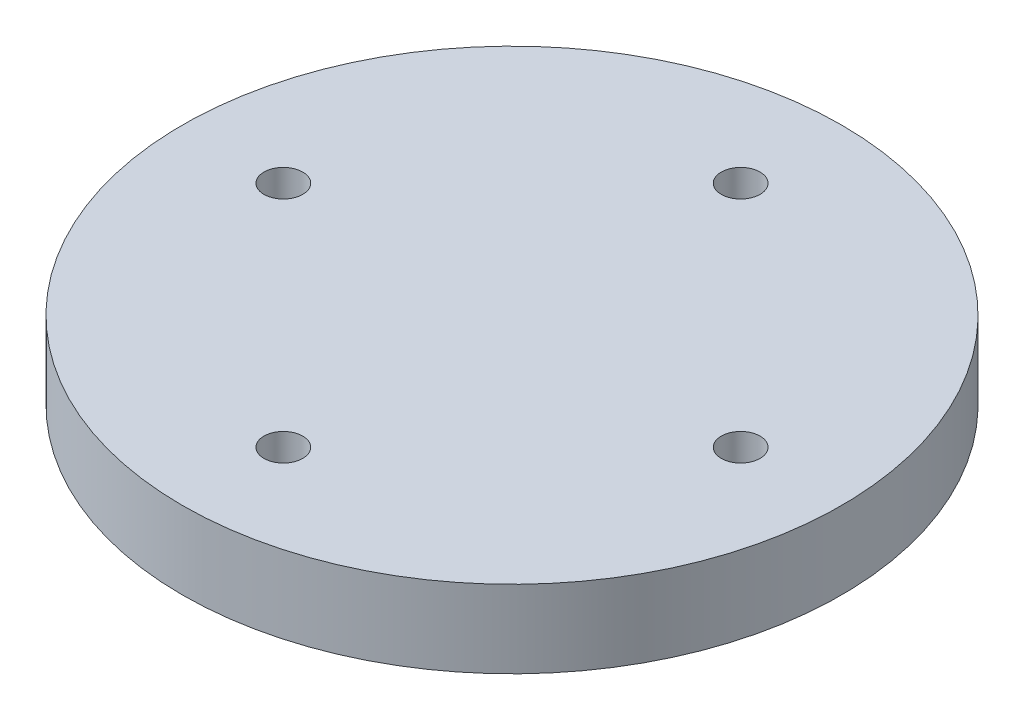
ISO-10303-21;
HEADER;
FILE_DESCRIPTION(('STEP AP214'),'2;1');
FILE_NAME('part.step','',(''),(''),'','','');
FILE_SCHEMA(('AUTOMOTIVE_DESIGN { 1 0 10303 214 1 1 1 1 }'));
ENDSEC;
DATA;
#1=APPLICATION_CONTEXT('core data for automotive mechanical design processes');
#2=APPLICATION_PROTOCOL_DEFINITION('international standard','automotive_design',2000,#1);
#3=PRODUCT_CONTEXT('',#1,'mechanical');
#4=PRODUCT('Part','Part','',(#3));
#5=PRODUCT_RELATED_PRODUCT_CATEGORY('part','',(#4));
#6=PRODUCT_DEFINITION_FORMATION('','',#4);
#7=PRODUCT_DEFINITION_CONTEXT('part definition',#1,'design');
#8=PRODUCT_DEFINITION('design','',#6,#7);
#9=PRODUCT_DEFINITION_SHAPE('','',#8);
#10=(LENGTH_UNIT() NAMED_UNIT(*) SI_UNIT(.MILLI.,.METRE.));
#11=(NAMED_UNIT(*) PLANE_ANGLE_UNIT() SI_UNIT($,.RADIAN.));
#12=(NAMED_UNIT(*) SI_UNIT($,.STERADIAN.) SOLID_ANGLE_UNIT());
#13=UNCERTAINTY_MEASURE_WITH_UNIT(LENGTH_MEASURE(1.E-05),#10,'distance_accuracy_value','');
#14=(GEOMETRIC_REPRESENTATION_CONTEXT(3) GLOBAL_UNCERTAINTY_ASSIGNED_CONTEXT((#13)) GLOBAL_UNIT_ASSIGNED_CONTEXT((#10,
#11,#12)) REPRESENTATION_CONTEXT('',''));
#15=CARTESIAN_POINT('',(0.,0.,0.));
#16=DIRECTION('',(0.,0.,1.));
#17=DIRECTION('',(1.,0.,0.));
#18=AXIS2_PLACEMENT_3D('',#15,#16,#17);
#19=CARTESIAN_POINT('',(0.,10.,0.));
#20=DIRECTION('',(0.,-1.,0.));
#21=DIRECTION('',(0.,0.,-1.));
#22=AXIS2_PLACEMENT_3D('',#19,#20,#21);
#23=CYLINDRICAL_SURFACE('',#22,42.5);
#24=CARTESIAN_POINT('',(0.,10.,0.));
#25=DIRECTION('',(0.,1.,0.));
#26=DIRECTION('',(0.,0.,1.));
#27=AXIS2_PLACEMENT_3D('',#24,#25,#26);
#28=CIRCLE('',#27,42.5);
#29=CARTESIAN_POINT('',(0.,10.,42.5));
#30=VERTEX_POINT('',#29);
#31=EDGE_CURVE('E10',#30,#30,#28,.T.);
#32=ORIENTED_EDGE('',*,*,#31,.F.);
#33=EDGE_LOOP('',(#32));
#34=FACE_BOUND('',#33,.T.);
#35=CARTESIAN_POINT('',(0.,0.,0.));
#36=DIRECTION('',(0.,1.,0.));
#37=DIRECTION('',(0.,0.,1.));
#38=AXIS2_PLACEMENT_3D('',#35,#36,#37);
#39=CIRCLE('',#38,42.5);
#40=CARTESIAN_POINT('',(0.,0.,42.5));
#41=VERTEX_POINT('',#40);
#42=EDGE_CURVE('E32',#41,#41,#39,.T.);
#43=ORIENTED_EDGE('',*,*,#42,.T.);
#44=EDGE_LOOP('',(#43));
#45=FACE_BOUND('',#44,.T.);
#46=ADVANCED_FACE('F29',(#34,#45),#23,.T.);
#47=CARTESIAN_POINT('',(0.,10.,0.));
#48=DIRECTION('',(0.,1.,0.));
#49=DIRECTION('',(0.,0.,1.));
#50=AXIS2_PLACEMENT_3D('',#47,#48,#49);
#51=PLANE('',#50);
#52=CARTESIAN_POINT('',(0.,10.,-29.4896013297068));
#53=DIRECTION('',(0.,1.,0.));
#54=DIRECTION('',(0.,0.,1.));
#55=AXIS2_PLACEMENT_3D('',#52,#53,#54);
#56=CIRCLE('',#55,2.49999999999982);
#57=CARTESIAN_POINT('',(0.,10.,-26.989601329707));
#58=VERTEX_POINT('',#57);
#59=EDGE_CURVE('E82',#58,#58,#56,.T.);
#60=ORIENTED_EDGE('',*,*,#59,.F.);
#61=EDGE_LOOP('',(#60));
#62=FACE_BOUND('',#61,.T.);
#63=CARTESIAN_POINT('',(29.4896013297072,10.,4.0549980755807E-13));
#64=DIRECTION('',(0.,1.,0.));
#65=DIRECTION('',(0.,0.,1.));
#66=AXIS2_PLACEMENT_3D('',#63,#64,#65);
#67=CIRCLE('',#66,2.5000000000003);
#68=CARTESIAN_POINT('',(29.4896013297072,10.,2.50000000000071));
#69=VERTEX_POINT('',#68);
#70=EDGE_CURVE('E76',#69,#69,#67,.T.);
#71=ORIENTED_EDGE('',*,*,#70,.F.);
#72=EDGE_LOOP('',(#71));
#73=FACE_BOUND('',#72,.T.);
#74=CARTESIAN_POINT('',(5.19296086602855E-13,10.,29.4896013297072));
#75=DIRECTION('',(0.,1.,0.));
#76=DIRECTION('',(0.,0.,1.));
#77=AXIS2_PLACEMENT_3D('',#74,#75,#76);
#78=CIRCLE('',#77,2.5);
#79=CARTESIAN_POINT('',(5.19296086602855E-13,10.,31.9896013297072));
#80=VERTEX_POINT('',#79);
#81=EDGE_CURVE('E70',#80,#80,#78,.T.);
#82=ORIENTED_EDGE('',*,*,#81,.F.);
#83=EDGE_LOOP('',(#82));
#84=FACE_BOUND('',#83,.T.);
#85=CARTESIAN_POINT('',(-29.4896013297072,10.,4.16333634234434E-13));
#86=DIRECTION('',(0.,1.,0.));
#87=DIRECTION('',(0.,0.,1.));
#88=AXIS2_PLACEMENT_3D('',#85,#86,#87);
#89=CIRCLE('',#88,2.5);
#90=CARTESIAN_POINT('',(-29.4896013297072,10.,2.50000000000042));
#91=VERTEX_POINT('',#90);
#92=EDGE_CURVE('E62',#91,#91,#89,.T.);
#93=ORIENTED_EDGE('',*,*,#92,.F.);
#94=EDGE_LOOP('',(#93));
#95=FACE_BOUND('',#94,.T.);
#96=ORIENTED_EDGE('',*,*,#31,.T.);
#97=EDGE_LOOP('',(#96));
#98=FACE_BOUND('',#97,.T.);
#99=ADVANCED_FACE('F109',(#62,#73,#84,#95,#98),#51,.T.);
#100=CARTESIAN_POINT('',(0.,0.,0.));
#101=DIRECTION('',(0.,1.,0.));
#102=DIRECTION('',(0.,0.,1.));
#103=AXIS2_PLACEMENT_3D('',#100,#101,#102);
#104=PLANE('',#103);
#105=CARTESIAN_POINT('',(0.,0.,-29.4896013297068));
#106=DIRECTION('',(0.,-1.,0.));
#107=DIRECTION('',(0.,0.,-1.));
#108=AXIS2_PLACEMENT_3D('',#105,#106,#107);
#109=CIRCLE('',#108,6.99999999999982);
#110=CARTESIAN_POINT('',(0.,0.,-36.4896013297066));
#111=VERTEX_POINT('',#110);
#112=EDGE_CURVE('E59',#111,#111,#109,.T.);
#113=ORIENTED_EDGE('',*,*,#112,.F.);
#114=EDGE_LOOP('',(#113));
#115=FACE_BOUND('',#114,.T.);
#116=CARTESIAN_POINT('',(29.4896013297072,0.,4.0549980755807E-13));
#117=DIRECTION('',(0.,-1.,0.));
#118=DIRECTION('',(0.,0.,-1.));
#119=AXIS2_PLACEMENT_3D('',#116,#117,#118);
#120=CIRCLE('',#119,7.0000000000003);
#121=CARTESIAN_POINT('',(29.4896013297072,0.,-6.99999999999989));
#122=VERTEX_POINT('',#121);
#123=EDGE_CURVE('E53',#122,#122,#120,.T.);
#124=ORIENTED_EDGE('',*,*,#123,.F.);
#125=EDGE_LOOP('',(#124));
#126=FACE_BOUND('',#125,.T.);
#127=CARTESIAN_POINT('',(5.19296086602855E-13,0.,29.4896013297072));
#128=DIRECTION('',(0.,-1.,0.));
#129=DIRECTION('',(0.,0.,-1.));
#130=AXIS2_PLACEMENT_3D('',#127,#128,#129);
#131=CIRCLE('',#130,7.);
#132=CARTESIAN_POINT('',(5.19296086602855E-13,0.,22.4896013297072));
#133=VERTEX_POINT('',#132);
#134=EDGE_CURVE('E47',#133,#133,#131,.T.);
#135=ORIENTED_EDGE('',*,*,#134,.F.);
#136=EDGE_LOOP('',(#135));
#137=FACE_BOUND('',#136,.T.);
#138=CARTESIAN_POINT('',(-29.4896013297072,0.,4.16333634234434E-13));
#139=DIRECTION('',(0.,-1.,0.));
#140=DIRECTION('',(0.,0.,-1.));
#141=AXIS2_PLACEMENT_3D('',#138,#139,#140);
#142=CIRCLE('',#141,7.);
#143=CARTESIAN_POINT('',(-29.4896013297072,0.,-6.99999999999958));
#144=VERTEX_POINT('',#143);
#145=EDGE_CURVE('E41',#144,#144,#142,.T.);
#146=ORIENTED_EDGE('',*,*,#145,.F.);
#147=EDGE_LOOP('',(#146));
#148=FACE_BOUND('',#147,.T.);
#149=ORIENTED_EDGE('',*,*,#42,.F.);
#150=EDGE_LOOP('',(#149));
#151=FACE_BOUND('',#150,.T.);
#152=ADVANCED_FACE('F105',(#115,#126,#137,#148,#151),#104,.F.);
#153=CARTESIAN_POINT('',(-29.4896013297072,6.,4.16333634234434E-13));
#154=DIRECTION('',(0.,-1.,0.));
#155=DIRECTION('',(0.,0.,-1.));
#156=AXIS2_PLACEMENT_3D('',#153,#154,#155);
#157=CYLINDRICAL_SURFACE('',#156,7.);
#158=CARTESIAN_POINT('',(-29.4896013297072,6.,4.16333634234434E-13));
#159=DIRECTION('',(0.,-1.,0.));
#160=DIRECTION('',(0.,0.,-1.));
#161=AXIS2_PLACEMENT_3D('',#158,#159,#160);
#162=CIRCLE('',#161,7.);
#163=CARTESIAN_POINT('',(-29.4896013297072,6.,-6.99999999999958));
#164=VERTEX_POINT('',#163);
#165=EDGE_CURVE('E39',#164,#164,#162,.T.);
#166=ORIENTED_EDGE('',*,*,#165,.F.);
#167=EDGE_LOOP('',(#166));
#168=FACE_BOUND('',#167,.T.);
#169=ORIENTED_EDGE('',*,*,#145,.T.);
#170=EDGE_LOOP('',(#169));
#171=FACE_BOUND('',#170,.T.);
#172=ADVANCED_FACE('F108',(#168,#171),#157,.F.);
#173=CARTESIAN_POINT('',(-29.4896013297072,6.,4.16333634234434E-13));
#174=DIRECTION('',(0.,-1.,0.));
#175=DIRECTION('',(0.,0.,-1.));
#176=AXIS2_PLACEMENT_3D('',#173,#174,#175);
#177=PLANE('',#176);
#178=CARTESIAN_POINT('',(-29.4896013297072,6.,4.16333634234434E-13));
#179=DIRECTION('',(0.,-1.,0.));
#180=DIRECTION('',(0.,0.,-1.));
#181=AXIS2_PLACEMENT_3D('',#178,#179,#180);
#182=CIRCLE('',#181,2.5);
#183=CARTESIAN_POINT('',(-29.4896013297072,6.,-2.49999999999959));
#184=VERTEX_POINT('',#183);
#185=EDGE_CURVE('E67',#184,#184,#182,.T.);
#186=ORIENTED_EDGE('',*,*,#185,.F.);
#187=EDGE_LOOP('',(#186));
#188=FACE_BOUND('',#187,.T.);
#189=ORIENTED_EDGE('',*,*,#165,.T.);
#190=EDGE_LOOP('',(#189));
#191=FACE_BOUND('',#190,.T.);
#192=ADVANCED_FACE('F134',(#188,#191),#177,.T.);
#193=CARTESIAN_POINT('',(5.19296086602855E-13,6.,29.4896013297072));
#194=DIRECTION('',(0.,-1.,0.));
#195=DIRECTION('',(0.,0.,-1.));
#196=AXIS2_PLACEMENT_3D('',#193,#194,#195);
#197=CYLINDRICAL_SURFACE('',#196,7.);
#198=CARTESIAN_POINT('',(5.19296086602855E-13,6.,29.4896013297072));
#199=DIRECTION('',(0.,-1.,0.));
#200=DIRECTION('',(0.,0.,-1.));
#201=AXIS2_PLACEMENT_3D('',#198,#199,#200);
#202=CIRCLE('',#201,7.);
#203=CARTESIAN_POINT('',(5.19296086602855E-13,6.,22.4896013297072));
#204=VERTEX_POINT('',#203);
#205=EDGE_CURVE('E44',#204,#204,#202,.T.);
#206=ORIENTED_EDGE('',*,*,#205,.F.);
#207=EDGE_LOOP('',(#206));
#208=FACE_BOUND('',#207,.T.);
#209=ORIENTED_EDGE('',*,*,#134,.T.);
#210=EDGE_LOOP('',(#209));
#211=FACE_BOUND('',#210,.T.);
#212=ADVANCED_FACE('F137',(#208,#211),#197,.F.);
#213=CARTESIAN_POINT('',(5.19296086602855E-13,6.,29.4896013297072));
#214=DIRECTION('',(0.,-1.,0.));
#215=DIRECTION('',(0.,0.,-1.));
#216=AXIS2_PLACEMENT_3D('',#213,#214,#215);
#217=PLANE('',#216);
#218=CARTESIAN_POINT('',(5.19296086602855E-13,6.,29.4896013297072));
#219=DIRECTION('',(0.,-1.,0.));
#220=DIRECTION('',(0.,0.,-1.));
#221=AXIS2_PLACEMENT_3D('',#218,#219,#220);
#222=CIRCLE('',#221,2.5);
#223=CARTESIAN_POINT('',(5.19296086602855E-13,6.,26.9896013297072));
#224=VERTEX_POINT('',#223);
#225=EDGE_CURVE('E73',#224,#224,#222,.T.);
#226=ORIENTED_EDGE('',*,*,#225,.F.);
#227=EDGE_LOOP('',(#226));
#228=FACE_BOUND('',#227,.T.);
#229=ORIENTED_EDGE('',*,*,#205,.T.);
#230=EDGE_LOOP('',(#229));
#231=FACE_BOUND('',#230,.T.);
#232=ADVANCED_FACE('F141',(#228,#231),#217,.T.);
#233=CARTESIAN_POINT('',(29.4896013297072,6.,4.0549980755807E-13));
#234=DIRECTION('',(0.,-1.,0.));
#235=DIRECTION('',(0.,0.,-1.));
#236=AXIS2_PLACEMENT_3D('',#233,#234,#235);
#237=CYLINDRICAL_SURFACE('',#236,7.0000000000003);
#238=CARTESIAN_POINT('',(29.4896013297072,6.,4.0549980755807E-13));
#239=DIRECTION('',(0.,-1.,0.));
#240=DIRECTION('',(0.,0.,-1.));
#241=AXIS2_PLACEMENT_3D('',#238,#239,#240);
#242=CIRCLE('',#241,7.0000000000003);
#243=CARTESIAN_POINT('',(29.4896013297072,6.,-6.99999999999989));
#244=VERTEX_POINT('',#243);
#245=EDGE_CURVE('E50',#244,#244,#242,.T.);
#246=ORIENTED_EDGE('',*,*,#245,.F.);
#247=EDGE_LOOP('',(#246));
#248=FACE_BOUND('',#247,.T.);
#249=ORIENTED_EDGE('',*,*,#123,.T.);
#250=EDGE_LOOP('',(#249));
#251=FACE_BOUND('',#250,.T.);
#252=ADVANCED_FACE('F145',(#248,#251),#237,.F.);
#253=CARTESIAN_POINT('',(29.4896013297072,6.,4.0549980755807E-13));
#254=DIRECTION('',(0.,-1.,0.));
#255=DIRECTION('',(0.,0.,-1.));
#256=AXIS2_PLACEMENT_3D('',#253,#254,#255);
#257=PLANE('',#256);
#258=CARTESIAN_POINT('',(29.4896013297072,6.,4.0549980755807E-13));
#259=DIRECTION('',(0.,-1.,0.));
#260=DIRECTION('',(0.,0.,-1.));
#261=AXIS2_PLACEMENT_3D('',#258,#259,#260);
#262=CIRCLE('',#261,2.5000000000003);
#263=CARTESIAN_POINT('',(29.4896013297072,6.,-2.4999999999999));
#264=VERTEX_POINT('',#263);
#265=EDGE_CURVE('E79',#264,#264,#262,.T.);
#266=ORIENTED_EDGE('',*,*,#265,.F.);
#267=EDGE_LOOP('',(#266));
#268=FACE_BOUND('',#267,.T.);
#269=ORIENTED_EDGE('',*,*,#245,.T.);
#270=EDGE_LOOP('',(#269));
#271=FACE_BOUND('',#270,.T.);
#272=ADVANCED_FACE('F101',(#268,#271),#257,.T.);
#273=CARTESIAN_POINT('',(0.,6.,-29.4896013297068));
#274=DIRECTION('',(0.,-1.,0.));
#275=DIRECTION('',(0.,0.,-1.));
#276=AXIS2_PLACEMENT_3D('',#273,#274,#275);
#277=CYLINDRICAL_SURFACE('',#276,6.99999999999982);
#278=CARTESIAN_POINT('',(0.,6.,-29.4896013297068));
#279=DIRECTION('',(0.,-1.,0.));
#280=DIRECTION('',(0.,0.,-1.));
#281=AXIS2_PLACEMENT_3D('',#278,#279,#280);
#282=CIRCLE('',#281,6.99999999999982);
#283=CARTESIAN_POINT('',(0.,6.,-36.4896013297066));
#284=VERTEX_POINT('',#283);
#285=EDGE_CURVE('E56',#284,#284,#282,.T.);
#286=ORIENTED_EDGE('',*,*,#285,.F.);
#287=EDGE_LOOP('',(#286));
#288=FACE_BOUND('',#287,.T.);
#289=ORIENTED_EDGE('',*,*,#112,.T.);
#290=EDGE_LOOP('',(#289));
#291=FACE_BOUND('',#290,.T.);
#292=ADVANCED_FACE('F95',(#288,#291),#277,.F.);
#293=CARTESIAN_POINT('',(0.,6.,-29.4896013297068));
#294=DIRECTION('',(0.,-1.,0.));
#295=DIRECTION('',(0.,0.,-1.));
#296=AXIS2_PLACEMENT_3D('',#293,#294,#295);
#297=PLANE('',#296);
#298=CARTESIAN_POINT('',(0.,6.,-29.4896013297068));
#299=DIRECTION('',(0.,-1.,0.));
#300=DIRECTION('',(0.,0.,-1.));
#301=AXIS2_PLACEMENT_3D('',#298,#299,#300);
#302=CIRCLE('',#301,2.49999999999982);
#303=CARTESIAN_POINT('',(0.,6.,-31.9896013297066));
#304=VERTEX_POINT('',#303);
#305=EDGE_CURVE('E85',#304,#304,#302,.T.);
#306=ORIENTED_EDGE('',*,*,#305,.F.);
#307=EDGE_LOOP('',(#306));
#308=FACE_BOUND('',#307,.T.);
#309=ORIENTED_EDGE('',*,*,#285,.T.);
#310=EDGE_LOOP('',(#309));
#311=FACE_BOUND('',#310,.T.);
#312=ADVANCED_FACE('F91',(#308,#311),#297,.T.);
#313=CARTESIAN_POINT('',(-29.4896013297072,12.,4.16333634234434E-13));
#314=DIRECTION('',(0.,-1.,0.));
#315=DIRECTION('',(0.,0.,-1.));
#316=AXIS2_PLACEMENT_3D('',#313,#314,#315);
#317=CYLINDRICAL_SURFACE('',#316,2.5);
#318=ORIENTED_EDGE('',*,*,#92,.T.);
#319=EDGE_LOOP('',(#318));
#320=FACE_BOUND('',#319,.T.);
#321=ORIENTED_EDGE('',*,*,#185,.T.);
#322=EDGE_LOOP('',(#321));
#323=FACE_BOUND('',#322,.T.);
#324=ADVANCED_FACE('F94',(#320,#323),#317,.F.);
#325=CARTESIAN_POINT('',(5.19296086602855E-13,12.,29.4896013297072));
#326=DIRECTION('',(0.,-1.,0.));
#327=DIRECTION('',(0.,0.,-1.));
#328=AXIS2_PLACEMENT_3D('',#325,#326,#327);
#329=CYLINDRICAL_SURFACE('',#328,2.5);
#330=ORIENTED_EDGE('',*,*,#81,.T.);
#331=EDGE_LOOP('',(#330));
#332=FACE_BOUND('',#331,.T.);
#333=ORIENTED_EDGE('',*,*,#225,.T.);
#334=EDGE_LOOP('',(#333));
#335=FACE_BOUND('',#334,.T.);
#336=ADVANCED_FACE('F155',(#332,#335),#329,.F.);
#337=CARTESIAN_POINT('',(29.4896013297072,12.,4.0549980755807E-13));
#338=DIRECTION('',(0.,-1.,0.));
#339=DIRECTION('',(0.,0.,-1.));
#340=AXIS2_PLACEMENT_3D('',#337,#338,#339);
#341=CYLINDRICAL_SURFACE('',#340,2.5000000000003);
#342=ORIENTED_EDGE('',*,*,#70,.T.);
#343=EDGE_LOOP('',(#342));
#344=FACE_BOUND('',#343,.T.);
#345=ORIENTED_EDGE('',*,*,#265,.T.);
#346=EDGE_LOOP('',(#345));
#347=FACE_BOUND('',#346,.T.);
#348=ADVANCED_FACE('F159',(#344,#347),#341,.F.);
#349=CARTESIAN_POINT('',(0.,12.,-29.4896013297068));
#350=DIRECTION('',(0.,-1.,0.));
#351=DIRECTION('',(0.,0.,-1.));
#352=AXIS2_PLACEMENT_3D('',#349,#350,#351);
#353=CYLINDRICAL_SURFACE('',#352,2.49999999999982);
#354=ORIENTED_EDGE('',*,*,#59,.T.);
#355=EDGE_LOOP('',(#354));
#356=FACE_BOUND('',#355,.T.);
#357=ORIENTED_EDGE('',*,*,#305,.T.);
#358=EDGE_LOOP('',(#357));
#359=FACE_BOUND('',#358,.T.);
#360=ADVANCED_FACE('F89',(#356,#359),#353,.F.);
#361=CLOSED_SHELL('',(#46,#99,#152,#172,#192,#212,#232,#252,#272,#292,#312,#324,#336,#348,#360));
#362=MANIFOLD_SOLID_BREP('B2',#361);
#363=ADVANCED_BREP_SHAPE_REPRESENTATION('',(#18,#362),#14);
#364=SHAPE_DEFINITION_REPRESENTATION(#9,#363);
ENDSEC;
END-ISO-10303-21;
